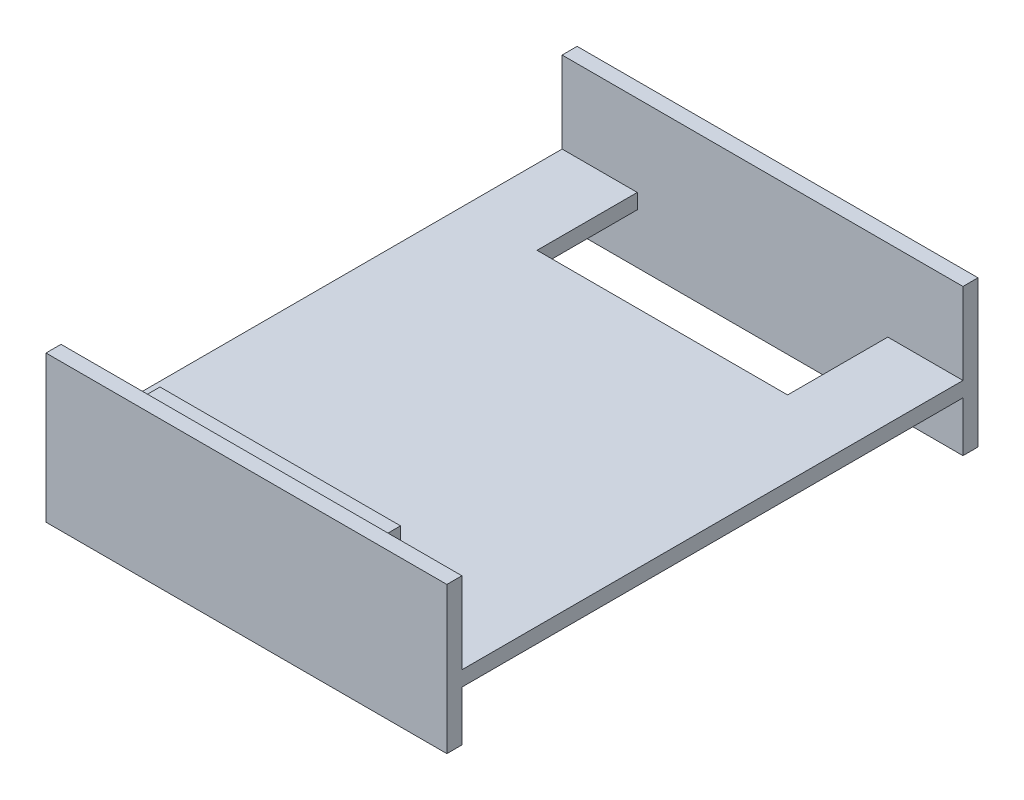
ISO-10303-21;
HEADER;
FILE_DESCRIPTION(('STEP AP214'),'2;1');
FILE_NAME('part.step','',(''),(''),'','','');
FILE_SCHEMA(('AUTOMOTIVE_DESIGN { 1 0 10303 214 1 1 1 1 }'));
ENDSEC;
DATA;
#1=APPLICATION_CONTEXT('core data for automotive mechanical design processes');
#2=APPLICATION_PROTOCOL_DEFINITION('international standard','automotive_design',2000,#1);
#3=PRODUCT_CONTEXT('',#1,'mechanical');
#4=PRODUCT('Part','Part','',(#3));
#5=PRODUCT_RELATED_PRODUCT_CATEGORY('part','',(#4));
#6=PRODUCT_DEFINITION_FORMATION('','',#4);
#7=PRODUCT_DEFINITION_CONTEXT('part definition',#1,'design');
#8=PRODUCT_DEFINITION('design','',#6,#7);
#9=PRODUCT_DEFINITION_SHAPE('','',#8);
#10=(LENGTH_UNIT() NAMED_UNIT(*) SI_UNIT(.MILLI.,.METRE.));
#11=(NAMED_UNIT(*) PLANE_ANGLE_UNIT() SI_UNIT($,.RADIAN.));
#12=(NAMED_UNIT(*) SI_UNIT($,.STERADIAN.) SOLID_ANGLE_UNIT());
#13=UNCERTAINTY_MEASURE_WITH_UNIT(LENGTH_MEASURE(1.E-05),#10,'distance_accuracy_value','');
#14=(GEOMETRIC_REPRESENTATION_CONTEXT(3) GLOBAL_UNCERTAINTY_ASSIGNED_CONTEXT((#13)) GLOBAL_UNIT_ASSIGNED_CONTEXT((#10,
#11,#12)) REPRESENTATION_CONTEXT('',''));
#15=CARTESIAN_POINT('',(0.,0.,0.));
#16=DIRECTION('',(0.,0.,1.));
#17=DIRECTION('',(1.,0.,0.));
#18=AXIS2_PLACEMENT_3D('',#15,#16,#17);
#19=CARTESIAN_POINT('',(0.,0.,0.));
#20=DIRECTION('',(0.,-1.,0.));
#21=DIRECTION('',(0.,0.,-1.));
#22=AXIS2_PLACEMENT_3D('',#19,#20,#21);
#23=PLANE('',#22);
#24=DIRECTION('',(0.,0.,1.));
#25=VECTOR('',#24,1.);
#26=CARTESIAN_POINT('',(0.,0.,-40.));
#27=LINE('',#26,#25);
#28=CARTESIAN_POINT('',(0.,0.,-40.));
#29=VERTEX_POINT('',#28);
#30=CARTESIAN_POINT('',(0.,0.,0.));
#31=VERTEX_POINT('',#30);
#32=EDGE_CURVE('E63',#29,#31,#27,.T.);
#33=ORIENTED_EDGE('',*,*,#32,.F.);
#34=DIRECTION('',(-1.,0.,0.));
#35=VECTOR('',#34,1.);
#36=CARTESIAN_POINT('',(0.,0.,-40.));
#37=LINE('',#36,#35);
#38=CARTESIAN_POINT('',(6.,0.,-40.));
#39=VERTEX_POINT('',#38);
#40=EDGE_CURVE('E425',#39,#29,#37,.T.);
#41=ORIENTED_EDGE('',*,*,#40,.F.);
#42=DIRECTION('',(0.,0.,1.));
#43=VECTOR('',#42,1.);
#44=CARTESIAN_POINT('',(6.,0.,-40.));
#45=LINE('',#44,#43);
#46=CARTESIAN_POINT('',(6.,0.,-32.));
#47=VERTEX_POINT('',#46);
#48=EDGE_CURVE('E260',#39,#47,#45,.T.);
#49=ORIENTED_EDGE('',*,*,#48,.T.);
#50=DIRECTION('',(1.,0.,0.));
#51=VECTOR('',#50,1.);
#52=CARTESIAN_POINT('',(6.,0.,-32.));
#53=LINE('',#52,#51);
#54=CARTESIAN_POINT('',(26.,0.,-32.));
#55=VERTEX_POINT('',#54);
#56=EDGE_CURVE('E237',#47,#55,#53,.T.);
#57=ORIENTED_EDGE('',*,*,#56,.T.);
#58=DIRECTION('',(0.,0.,-1.));
#59=VECTOR('',#58,1.);
#60=CARTESIAN_POINT('',(26.,0.,-32.));
#61=LINE('',#60,#59);
#62=CARTESIAN_POINT('',(26.,0.,-40.));
#63=VERTEX_POINT('',#62);
#64=EDGE_CURVE('E241',#55,#63,#61,.T.);
#65=ORIENTED_EDGE('',*,*,#64,.T.);
#66=CARTESIAN_POINT('',(32.,0.,-40.));
#67=VERTEX_POINT('',#66);
#68=EDGE_CURVE('E56',#67,#63,#37,.T.);
#69=ORIENTED_EDGE('',*,*,#68,.F.);
#70=DIRECTION('',(0.,0.,-1.));
#71=VECTOR('',#70,1.);
#72=CARTESIAN_POINT('',(32.,0.,-41.2));
#73=LINE('',#72,#71);
#74=CARTESIAN_POINT('',(32.,0.,0.));
#75=VERTEX_POINT('',#74);
#76=EDGE_CURVE('E203',#75,#67,#73,.T.);
#77=ORIENTED_EDGE('',*,*,#76,.F.);
#78=DIRECTION('',(1.,0.,0.));
#79=VECTOR('',#78,1.);
#80=CARTESIAN_POINT('',(0.,0.,0.));
#81=LINE('',#80,#79);
#82=EDGE_CURVE('E205',#31,#75,#81,.T.);
#83=ORIENTED_EDGE('',*,*,#82,.F.);
#84=EDGE_LOOP('',(#33,#41,#49,#57,#65,#69,#77,#83));
#85=FACE_BOUND('',#84,.T.);
#86=ADVANCED_FACE('F40',(#85),#23,.T.);
#87=CARTESIAN_POINT('',(0.,1.2,0.));
#88=DIRECTION('',(0.,-1.,0.));
#89=DIRECTION('',(0.,0.,-1.));
#90=AXIS2_PLACEMENT_3D('',#87,#88,#89);
#91=PLANE('',#90);
#92=DIRECTION('',(1.,0.,0.));
#93=VECTOR('',#92,1.);
#94=CARTESIAN_POINT('',(32.,1.2,-40.));
#95=LINE('',#94,#93);
#96=CARTESIAN_POINT('',(26.,1.2,-40.));
#97=VERTEX_POINT('',#96);
#98=CARTESIAN_POINT('',(32.,1.2,-40.));
#99=VERTEX_POINT('',#98);
#100=EDGE_CURVE('E313',#97,#99,#95,.T.);
#101=ORIENTED_EDGE('',*,*,#100,.F.);
#102=DIRECTION('',(0.,0.,-1.));
#103=VECTOR('',#102,1.);
#104=CARTESIAN_POINT('',(26.,1.2,-32.));
#105=LINE('',#104,#103);
#106=CARTESIAN_POINT('',(26.,1.2,-32.));
#107=VERTEX_POINT('',#106);
#108=EDGE_CURVE('E252',#107,#97,#105,.T.);
#109=ORIENTED_EDGE('',*,*,#108,.F.);
#110=DIRECTION('',(1.,0.,0.));
#111=VECTOR('',#110,1.);
#112=CARTESIAN_POINT('',(6.,1.2,-32.));
#113=LINE('',#112,#111);
#114=CARTESIAN_POINT('',(6.,1.2,-32.));
#115=VERTEX_POINT('',#114);
#116=EDGE_CURVE('E248',#115,#107,#113,.T.);
#117=ORIENTED_EDGE('',*,*,#116,.F.);
#118=DIRECTION('',(0.,0.,1.));
#119=VECTOR('',#118,1.);
#120=CARTESIAN_POINT('',(6.,1.2,-40.));
#121=LINE('',#120,#119);
#122=CARTESIAN_POINT('',(6.,1.2,-40.));
#123=VERTEX_POINT('',#122);
#124=EDGE_CURVE('E244',#123,#115,#121,.T.);
#125=ORIENTED_EDGE('',*,*,#124,.F.);
#126=CARTESIAN_POINT('',(0.,1.2,-40.));
#127=VERTEX_POINT('',#126);
#128=EDGE_CURVE('E319',#127,#123,#95,.T.);
#129=ORIENTED_EDGE('',*,*,#128,.F.);
#130=DIRECTION('',(0.,0.,1.));
#131=VECTOR('',#130,1.);
#132=CARTESIAN_POINT('',(0.,1.2,1.2));
#133=LINE('',#132,#131);
#134=CARTESIAN_POINT('',(0.,1.2,0.));
#135=VERTEX_POINT('',#134);
#136=EDGE_CURVE('E367',#127,#135,#133,.T.);
#137=ORIENTED_EDGE('',*,*,#136,.T.);
#138=DIRECTION('',(-1.,0.,0.));
#139=VECTOR('',#138,1.);
#140=CARTESIAN_POINT('',(32.,1.2,0.));
#141=LINE('',#140,#139);
#142=CARTESIAN_POINT('',(6.4,1.2,0.));
#143=VERTEX_POINT('',#142);
#144=EDGE_CURVE('E340',#143,#135,#141,.T.);
#145=ORIENTED_EDGE('',*,*,#144,.F.);
#146=DIRECTION('',(0.,0.,1.));
#147=VECTOR('',#146,1.);
#148=CARTESIAN_POINT('',(6.4,1.2,0.));
#149=LINE('',#148,#147);
#150=CARTESIAN_POINT('',(6.4,1.2,-1.5));
#151=VERTEX_POINT('',#150);
#152=EDGE_CURVE('E278',#151,#143,#149,.T.);
#153=ORIENTED_EDGE('',*,*,#152,.F.);
#154=DIRECTION('',(-1.,0.,0.));
#155=VECTOR('',#154,1.);
#156=CARTESIAN_POINT('',(6.4,1.2,-1.5));
#157=LINE('',#156,#155);
#158=CARTESIAN_POINT('',(25.6,1.2,-1.5));
#159=VERTEX_POINT('',#158);
#160=EDGE_CURVE('E292',#159,#151,#157,.T.);
#161=ORIENTED_EDGE('',*,*,#160,.F.);
#162=DIRECTION('',(0.,0.,-1.));
#163=VECTOR('',#162,1.);
#164=CARTESIAN_POINT('',(25.6,1.2,0.));
#165=LINE('',#164,#163);
#166=CARTESIAN_POINT('',(25.6,1.2,0.));
#167=VERTEX_POINT('',#166);
#168=EDGE_CURVE('E272',#167,#159,#165,.T.);
#169=ORIENTED_EDGE('',*,*,#168,.F.);
#170=CARTESIAN_POINT('',(32.,1.2,0.));
#171=VERTEX_POINT('',#170);
#172=EDGE_CURVE('E346',#171,#167,#141,.T.);
#173=ORIENTED_EDGE('',*,*,#172,.F.);
#174=DIRECTION('',(0.,0.,-1.));
#175=VECTOR('',#174,1.);
#176=CARTESIAN_POINT('',(32.,1.2,1.2));
#177=LINE('',#176,#175);
#178=EDGE_CURVE('E371',#171,#99,#177,.T.);
#179=ORIENTED_EDGE('',*,*,#178,.T.);
#180=EDGE_LOOP('',(#101,#109,#117,#125,#129,#137,#145,#153,#161,#169,#173,#179));
#181=FACE_BOUND('',#180,.T.);
#182=ADVANCED_FACE('F411',(#181),#91,.F.);
#183=CARTESIAN_POINT('',(32.,7.7,0.));
#184=DIRECTION('',(0.,0.,1.));
#185=DIRECTION('',(1.,0.,0.));
#186=AXIS2_PLACEMENT_3D('',#183,#184,#185);
#187=PLANE('',#186);
#188=DIRECTION('',(0.,-1.,0.));
#189=VECTOR('',#188,1.);
#190=CARTESIAN_POINT('',(25.6,7.2,0.));
#191=LINE('',#190,#189);
#192=CARTESIAN_POINT('',(25.6,7.2,0.));
#193=VERTEX_POINT('',#192);
#194=EDGE_CURVE('E309',#193,#167,#191,.T.);
#195=ORIENTED_EDGE('',*,*,#194,.F.);
#196=DIRECTION('',(1.,0.,0.));
#197=VECTOR('',#196,1.);
#198=CARTESIAN_POINT('',(16.,7.2,0.));
#199=LINE('',#198,#197);
#200=CARTESIAN_POINT('',(6.4,7.2,0.));
#201=VERTEX_POINT('',#200);
#202=EDGE_CURVE('E273',#201,#193,#199,.T.);
#203=ORIENTED_EDGE('',*,*,#202,.F.);
#204=DIRECTION('',(0.,-1.,0.));
#205=VECTOR('',#204,1.);
#206=CARTESIAN_POINT('',(6.4,7.2,0.));
#207=LINE('',#206,#205);
#208=EDGE_CURVE('E288',#201,#143,#207,.T.);
#209=ORIENTED_EDGE('',*,*,#208,.T.);
#210=ORIENTED_EDGE('',*,*,#144,.T.);
#211=DIRECTION('',(0.,-1.,0.));
#212=VECTOR('',#211,1.);
#213=CARTESIAN_POINT('',(0.,7.7,0.));
#214=LINE('',#213,#212);
#215=CARTESIAN_POINT('',(0.,7.7,0.));
#216=VERTEX_POINT('',#215);
#217=EDGE_CURVE('E363',#216,#135,#214,.T.);
#218=ORIENTED_EDGE('',*,*,#217,.F.);
#219=DIRECTION('',(-1.,0.,0.));
#220=VECTOR('',#219,1.);
#221=CARTESIAN_POINT('',(32.,7.7,0.));
#222=LINE('',#221,#220);
#223=CARTESIAN_POINT('',(32.,7.7,0.));
#224=VERTEX_POINT('',#223);
#225=EDGE_CURVE('E341',#224,#216,#222,.T.);
#226=ORIENTED_EDGE('',*,*,#225,.F.);
#227=DIRECTION('',(0.,-1.,0.));
#228=VECTOR('',#227,1.);
#229=CARTESIAN_POINT('',(32.,7.7,0.));
#230=LINE('',#229,#228);
#231=EDGE_CURVE('E356',#224,#171,#230,.T.);
#232=ORIENTED_EDGE('',*,*,#231,.T.);
#233=ORIENTED_EDGE('',*,*,#172,.T.);
#234=EDGE_LOOP('',(#195,#203,#209,#210,#218,#226,#232,#233));
#235=FACE_BOUND('',#234,.T.);
#236=ADVANCED_FACE('F403',(#235),#187,.F.);
#237=CARTESIAN_POINT('',(0.,1.2,1.2));
#238=DIRECTION('',(0.,0.,-1.));
#239=DIRECTION('',(-1.,0.,0.));
#240=AXIS2_PLACEMENT_3D('',#237,#238,#239);
#241=PLANE('',#240);
#242=DIRECTION('',(0.,-1.,0.));
#243=VECTOR('',#242,1.);
#244=CARTESIAN_POINT('',(0.,1.2,1.2));
#245=LINE('',#244,#243);
#246=CARTESIAN_POINT('',(0.,7.7,1.2));
#247=VERTEX_POINT('',#246);
#248=CARTESIAN_POINT('',(0.,-4.,1.2));
#249=VERTEX_POINT('',#248);
#250=EDGE_CURVE('E11',#247,#249,#245,.T.);
#251=ORIENTED_EDGE('',*,*,#250,.T.);
#252=DIRECTION('',(-1.,0.,0.));
#253=VECTOR('',#252,1.);
#254=CARTESIAN_POINT('',(32.,-4.,1.2));
#255=LINE('',#254,#253);
#256=CARTESIAN_POINT('',(32.,-4.,1.2));
#257=VERTEX_POINT('',#256);
#258=EDGE_CURVE('E223',#257,#249,#255,.T.);
#259=ORIENTED_EDGE('',*,*,#258,.F.);
#260=DIRECTION('',(0.,-1.,0.));
#261=VECTOR('',#260,1.);
#262=CARTESIAN_POINT('',(32.,1.2,1.2));
#263=LINE('',#262,#261);
#264=CARTESIAN_POINT('',(32.,7.7,1.2));
#265=VERTEX_POINT('',#264);
#266=EDGE_CURVE('E49',#265,#257,#263,.T.);
#267=ORIENTED_EDGE('',*,*,#266,.F.);
#268=DIRECTION('',(1.,0.,0.));
#269=VECTOR('',#268,1.);
#270=CARTESIAN_POINT('',(0.,7.7,1.2));
#271=LINE('',#270,#269);
#272=EDGE_CURVE('E350',#247,#265,#271,.T.);
#273=ORIENTED_EDGE('',*,*,#272,.F.);
#274=EDGE_LOOP('',(#251,#259,#267,#273));
#275=FACE_BOUND('',#274,.T.);
#276=ADVANCED_FACE('F42',(#275),#241,.F.);
#277=CARTESIAN_POINT('',(32.,1.2,-41.2));
#278=DIRECTION('',(-1.,0.,0.));
#279=DIRECTION('',(0.,0.,1.));
#280=AXIS2_PLACEMENT_3D('',#277,#278,#279);
#281=PLANE('',#280);
#282=ORIENTED_EDGE('',*,*,#266,.T.);
#283=DIRECTION('',(0.,0.,1.));
#284=VECTOR('',#283,1.);
#285=CARTESIAN_POINT('',(32.,-4.,0.));
#286=LINE('',#285,#284);
#287=CARTESIAN_POINT('',(32.,-4.,0.));
#288=VERTEX_POINT('',#287);
#289=EDGE_CURVE('E219',#288,#257,#286,.T.);
#290=ORIENTED_EDGE('',*,*,#289,.F.);
#291=DIRECTION('',(0.,1.,0.));
#292=VECTOR('',#291,1.);
#293=CARTESIAN_POINT('',(32.,-4.,0.));
#294=LINE('',#293,#292);
#295=EDGE_CURVE('E234',#288,#75,#294,.T.);
#296=ORIENTED_EDGE('',*,*,#295,.T.);
#297=ORIENTED_EDGE('',*,*,#76,.T.);
#298=DIRECTION('',(0.,1.,0.));
#299=VECTOR('',#298,1.);
#300=CARTESIAN_POINT('',(32.,-4.,-40.));
#301=LINE('',#300,#299);
#302=CARTESIAN_POINT('',(32.,-4.,-40.));
#303=VERTEX_POINT('',#302);
#304=EDGE_CURVE('E183',#303,#67,#301,.T.);
#305=ORIENTED_EDGE('',*,*,#304,.F.);
#306=DIRECTION('',(0.,0.,1.));
#307=VECTOR('',#306,1.);
#308=CARTESIAN_POINT('',(32.,-4.,-41.2));
#309=LINE('',#308,#307);
#310=CARTESIAN_POINT('',(32.,-4.,-41.2));
#311=VERTEX_POINT('',#310);
#312=EDGE_CURVE('E191',#311,#303,#309,.T.);
#313=ORIENTED_EDGE('',*,*,#312,.F.);
#314=DIRECTION('',(0.,-1.,0.));
#315=VECTOR('',#314,1.);
#316=CARTESIAN_POINT('',(32.,1.2,-41.2));
#317=LINE('',#316,#315);
#318=CARTESIAN_POINT('',(32.,7.7,-41.2));
#319=VERTEX_POINT('',#318);
#320=EDGE_CURVE('E382',#319,#311,#317,.T.);
#321=ORIENTED_EDGE('',*,*,#320,.F.);
#322=DIRECTION('',(0.,0.,-1.));
#323=VECTOR('',#322,1.);
#324=CARTESIAN_POINT('',(32.,7.7,-41.2));
#325=LINE('',#324,#323);
#326=CARTESIAN_POINT('',(32.,7.7,-40.));
#327=VERTEX_POINT('',#326);
#328=EDGE_CURVE('E322',#327,#319,#325,.T.);
#329=ORIENTED_EDGE('',*,*,#328,.F.);
#330=DIRECTION('',(0.,-1.,0.));
#331=VECTOR('',#330,1.);
#332=CARTESIAN_POINT('',(32.,7.7,-40.));
#333=LINE('',#332,#331);
#334=EDGE_CURVE('E330',#327,#99,#333,.T.);
#335=ORIENTED_EDGE('',*,*,#334,.T.);
#336=ORIENTED_EDGE('',*,*,#178,.F.);
#337=ORIENTED_EDGE('',*,*,#231,.F.);
#338=DIRECTION('',(0.,0.,-1.));
#339=VECTOR('',#338,1.);
#340=CARTESIAN_POINT('',(32.,7.7,1.2));
#341=LINE('',#340,#339);
#342=EDGE_CURVE('E353',#265,#224,#341,.T.);
#343=ORIENTED_EDGE('',*,*,#342,.F.);
#344=EDGE_LOOP('',(#282,#290,#296,#297,#305,#313,#321,#329,#335,#336,#337,#343));
#345=FACE_BOUND('',#344,.T.);
#346=ADVANCED_FACE('F201',(#345),#281,.F.);
#347=CARTESIAN_POINT('',(0.,1.2,-41.2));
#348=DIRECTION('',(0.,0.,1.));
#349=DIRECTION('',(1.,0.,0.));
#350=AXIS2_PLACEMENT_3D('',#347,#348,#349);
#351=PLANE('',#350);
#352=ORIENTED_EDGE('',*,*,#320,.T.);
#353=DIRECTION('',(1.,0.,0.));
#354=VECTOR('',#353,1.);
#355=CARTESIAN_POINT('',(0.,-4.,-41.2));
#356=LINE('',#355,#354);
#357=CARTESIAN_POINT('',(0.,-4.,-41.2));
#358=VERTEX_POINT('',#357);
#359=EDGE_CURVE('E197',#358,#311,#356,.T.);
#360=ORIENTED_EDGE('',*,*,#359,.F.);
#361=DIRECTION('',(0.,-1.,0.));
#362=VECTOR('',#361,1.);
#363=CARTESIAN_POINT('',(0.,1.2,-41.2));
#364=LINE('',#363,#362);
#365=CARTESIAN_POINT('',(0.,7.7,-41.2));
#366=VERTEX_POINT('',#365);
#367=EDGE_CURVE('E375',#366,#358,#364,.T.);
#368=ORIENTED_EDGE('',*,*,#367,.F.);
#369=DIRECTION('',(-1.,0.,0.));
#370=VECTOR('',#369,1.);
#371=CARTESIAN_POINT('',(0.,7.7,-41.2));
#372=LINE('',#371,#370);
#373=EDGE_CURVE('E326',#319,#366,#372,.T.);
#374=ORIENTED_EDGE('',*,*,#373,.F.);
#375=EDGE_LOOP('',(#352,#360,#368,#374));
#376=FACE_BOUND('',#375,.T.);
#377=ADVANCED_FACE('F421',(#376),#351,.F.);
#378=CARTESIAN_POINT('',(0.,1.2,-40.));
#379=DIRECTION('',(1.,0.,0.));
#380=DIRECTION('',(0.,0.,-1.));
#381=AXIS2_PLACEMENT_3D('',#378,#379,#380);
#382=PLANE('',#381);
#383=ORIENTED_EDGE('',*,*,#367,.T.);
#384=DIRECTION('',(0.,0.,-1.));
#385=VECTOR('',#384,1.);
#386=CARTESIAN_POINT('',(0.,-4.,-40.));
#387=LINE('',#386,#385);
#388=CARTESIAN_POINT('',(0.,-4.,-40.));
#389=VERTEX_POINT('',#388);
#390=EDGE_CURVE('E190',#389,#358,#387,.T.);
#391=ORIENTED_EDGE('',*,*,#390,.F.);
#392=DIRECTION('',(0.,1.,0.));
#393=VECTOR('',#392,1.);
#394=CARTESIAN_POINT('',(0.,-4.,-40.));
#395=LINE('',#394,#393);
#396=EDGE_CURVE('E185',#389,#29,#395,.T.);
#397=ORIENTED_EDGE('',*,*,#396,.T.);
#398=ORIENTED_EDGE('',*,*,#32,.T.);
#399=DIRECTION('',(0.,1.,0.));
#400=VECTOR('',#399,1.);
#401=CARTESIAN_POINT('',(0.,-4.,0.));
#402=LINE('',#401,#400);
#403=CARTESIAN_POINT('',(0.,-4.,0.));
#404=VERTEX_POINT('',#403);
#405=EDGE_CURVE('E229',#404,#31,#402,.T.);
#406=ORIENTED_EDGE('',*,*,#405,.F.);
#407=DIRECTION('',(0.,0.,-1.));
#408=VECTOR('',#407,1.);
#409=CARTESIAN_POINT('',(0.,-4.,1.2));
#410=LINE('',#409,#408);
#411=EDGE_CURVE('E227',#249,#404,#410,.T.);
#412=ORIENTED_EDGE('',*,*,#411,.F.);
#413=ORIENTED_EDGE('',*,*,#250,.F.);
#414=DIRECTION('',(0.,0.,1.));
#415=VECTOR('',#414,1.);
#416=CARTESIAN_POINT('',(0.,7.7,0.));
#417=LINE('',#416,#415);
#418=EDGE_CURVE('E345',#216,#247,#417,.T.);
#419=ORIENTED_EDGE('',*,*,#418,.F.);
#420=ORIENTED_EDGE('',*,*,#217,.T.);
#421=ORIENTED_EDGE('',*,*,#136,.F.);
#422=DIRECTION('',(0.,-1.,0.));
#423=VECTOR('',#422,1.);
#424=CARTESIAN_POINT('',(0.,7.7,-40.));
#425=LINE('',#424,#423);
#426=CARTESIAN_POINT('',(0.,7.7,-40.));
#427=VERTEX_POINT('',#426);
#428=EDGE_CURVE('E336',#427,#127,#425,.T.);
#429=ORIENTED_EDGE('',*,*,#428,.F.);
#430=DIRECTION('',(0.,0.,1.));
#431=VECTOR('',#430,1.);
#432=CARTESIAN_POINT('',(0.,7.7,-40.));
#433=LINE('',#432,#431);
#434=EDGE_CURVE('E314',#366,#427,#433,.T.);
#435=ORIENTED_EDGE('',*,*,#434,.F.);
#436=EDGE_LOOP('',(#383,#391,#397,#398,#406,#412,#413,#419,#420,#421,#429,#435));
#437=FACE_BOUND('',#436,.T.);
#438=ADVANCED_FACE('F396',(#437),#382,.F.);
#439=CARTESIAN_POINT('',(0.,7.7,0.));
#440=DIRECTION('',(0.,1.,0.));
#441=DIRECTION('',(0.,0.,1.));
#442=AXIS2_PLACEMENT_3D('',#439,#440,#441);
#443=PLANE('',#442);
#444=ORIENTED_EDGE('',*,*,#225,.T.);
#445=ORIENTED_EDGE('',*,*,#418,.T.);
#446=ORIENTED_EDGE('',*,*,#272,.T.);
#447=ORIENTED_EDGE('',*,*,#342,.T.);
#448=EDGE_LOOP('',(#444,#445,#446,#447));
#449=FACE_BOUND('',#448,.T.);
#450=ADVANCED_FACE('F399',(#449),#443,.T.);
#451=CARTESIAN_POINT('',(32.,7.7,-40.));
#452=DIRECTION('',(0.,0.,-1.));
#453=DIRECTION('',(-1.,0.,0.));
#454=AXIS2_PLACEMENT_3D('',#451,#452,#453);
#455=PLANE('',#454);
#456=ORIENTED_EDGE('',*,*,#128,.T.);
#457=DIRECTION('',(0.,1.,0.));
#458=VECTOR('',#457,1.);
#459=CARTESIAN_POINT('',(6.,-0.000999999999999916,-40.));
#460=LINE('',#459,#458);
#461=EDGE_CURVE('E255',#39,#123,#460,.T.);
#462=ORIENTED_EDGE('',*,*,#461,.F.);
#463=ORIENTED_EDGE('',*,*,#40,.T.);
#464=ORIENTED_EDGE('',*,*,#396,.F.);
#465=DIRECTION('',(-1.,0.,0.));
#466=VECTOR('',#465,1.);
#467=CARTESIAN_POINT('',(0.,-4.,-40.));
#468=LINE('',#467,#466);
#469=EDGE_CURVE('E178',#303,#389,#468,.T.);
#470=ORIENTED_EDGE('',*,*,#469,.F.);
#471=ORIENTED_EDGE('',*,*,#304,.T.);
#472=ORIENTED_EDGE('',*,*,#68,.T.);
#473=DIRECTION('',(0.,1.,0.));
#474=VECTOR('',#473,1.);
#475=CARTESIAN_POINT('',(26.,-0.000999999999999916,-40.));
#476=LINE('',#475,#474);
#477=EDGE_CURVE('E256',#63,#97,#476,.T.);
#478=ORIENTED_EDGE('',*,*,#477,.T.);
#479=ORIENTED_EDGE('',*,*,#100,.T.);
#480=ORIENTED_EDGE('',*,*,#334,.F.);
#481=DIRECTION('',(1.,0.,0.));
#482=VECTOR('',#481,1.);
#483=CARTESIAN_POINT('',(32.,7.7,-40.));
#484=LINE('',#483,#482);
#485=EDGE_CURVE('E318',#427,#327,#484,.T.);
#486=ORIENTED_EDGE('',*,*,#485,.F.);
#487=ORIENTED_EDGE('',*,*,#428,.T.);
#488=EDGE_LOOP('',(#456,#462,#463,#464,#470,#471,#472,#478,#479,#480,#486,#487));
#489=FACE_BOUND('',#488,.T.);
#490=ADVANCED_FACE('F181',(#489),#455,.F.);
#491=CARTESIAN_POINT('',(0.,7.7,0.));
#492=DIRECTION('',(0.,-1.,0.));
#493=DIRECTION('',(0.,0.,-1.));
#494=AXIS2_PLACEMENT_3D('',#491,#492,#493);
#495=PLANE('',#494);
#496=ORIENTED_EDGE('',*,*,#434,.T.);
#497=ORIENTED_EDGE('',*,*,#485,.T.);
#498=ORIENTED_EDGE('',*,*,#328,.T.);
#499=ORIENTED_EDGE('',*,*,#373,.T.);
#500=EDGE_LOOP('',(#496,#497,#498,#499));
#501=FACE_BOUND('',#500,.T.);
#502=ADVANCED_FACE('F416',(#501),#495,.F.);
#503=CARTESIAN_POINT('',(25.6,7.2,0.));
#504=DIRECTION('',(-1.,0.,0.));
#505=DIRECTION('',(0.,0.,1.));
#506=AXIS2_PLACEMENT_3D('',#503,#504,#505);
#507=PLANE('',#506);
#508=ORIENTED_EDGE('',*,*,#168,.T.);
#509=DIRECTION('',(0.,-1.,0.));
#510=VECTOR('',#509,1.);
#511=CARTESIAN_POINT('',(25.6,7.2,-1.5));
#512=LINE('',#511,#510);
#513=CARTESIAN_POINT('',(25.6,7.2,-1.5));
#514=VERTEX_POINT('',#513);
#515=EDGE_CURVE('E305',#514,#159,#512,.T.);
#516=ORIENTED_EDGE('',*,*,#515,.F.);
#517=DIRECTION('',(0.,0.,-1.));
#518=VECTOR('',#517,1.);
#519=CARTESIAN_POINT('',(25.6,7.2,0.));
#520=LINE('',#519,#518);
#521=EDGE_CURVE('E277',#193,#514,#520,.T.);
#522=ORIENTED_EDGE('',*,*,#521,.F.);
#523=ORIENTED_EDGE('',*,*,#194,.T.);
#524=EDGE_LOOP('',(#508,#516,#522,#523));
#525=FACE_BOUND('',#524,.T.);
#526=ADVANCED_FACE('F469',(#525),#507,.F.);
#527=CARTESIAN_POINT('',(6.4,7.2,-1.5));
#528=DIRECTION('',(0.,0.,1.));
#529=DIRECTION('',(1.,0.,0.));
#530=AXIS2_PLACEMENT_3D('',#527,#528,#529);
#531=PLANE('',#530);
#532=ORIENTED_EDGE('',*,*,#160,.T.);
#533=DIRECTION('',(0.,-1.,0.));
#534=VECTOR('',#533,1.);
#535=CARTESIAN_POINT('',(6.4,7.2,-1.5));
#536=LINE('',#535,#534);
#537=CARTESIAN_POINT('',(6.4,7.2,-1.5));
#538=VERTEX_POINT('',#537);
#539=EDGE_CURVE('E301',#538,#151,#536,.T.);
#540=ORIENTED_EDGE('',*,*,#539,.F.);
#541=DIRECTION('',(-1.,0.,0.));
#542=VECTOR('',#541,1.);
#543=CARTESIAN_POINT('',(6.4,7.2,-1.5));
#544=LINE('',#543,#542);
#545=EDGE_CURVE('E281',#514,#538,#544,.T.);
#546=ORIENTED_EDGE('',*,*,#545,.F.);
#547=ORIENTED_EDGE('',*,*,#515,.T.);
#548=EDGE_LOOP('',(#532,#540,#546,#547));
#549=FACE_BOUND('',#548,.T.);
#550=ADVANCED_FACE('F472',(#549),#531,.F.);
#551=CARTESIAN_POINT('',(6.4,7.2,0.));
#552=DIRECTION('',(1.,0.,0.));
#553=DIRECTION('',(0.,0.,-1.));
#554=AXIS2_PLACEMENT_3D('',#551,#552,#553);
#555=PLANE('',#554);
#556=ORIENTED_EDGE('',*,*,#152,.T.);
#557=ORIENTED_EDGE('',*,*,#208,.F.);
#558=DIRECTION('',(0.,0.,1.));
#559=VECTOR('',#558,1.);
#560=CARTESIAN_POINT('',(6.4,7.2,0.));
#561=LINE('',#560,#559);
#562=EDGE_CURVE('E284',#538,#201,#561,.T.);
#563=ORIENTED_EDGE('',*,*,#562,.F.);
#564=ORIENTED_EDGE('',*,*,#539,.T.);
#565=EDGE_LOOP('',(#556,#557,#563,#564));
#566=FACE_BOUND('',#565,.T.);
#567=ADVANCED_FACE('F476',(#566),#555,.F.);
#568=CARTESIAN_POINT('',(0.,7.2,0.));
#569=DIRECTION('',(0.,-1.,0.));
#570=DIRECTION('',(0.,0.,-1.));
#571=AXIS2_PLACEMENT_3D('',#568,#569,#570);
#572=PLANE('',#571);
#573=ORIENTED_EDGE('',*,*,#202,.T.);
#574=ORIENTED_EDGE('',*,*,#521,.T.);
#575=ORIENTED_EDGE('',*,*,#545,.T.);
#576=ORIENTED_EDGE('',*,*,#562,.T.);
#577=EDGE_LOOP('',(#573,#574,#575,#576));
#578=FACE_BOUND('',#577,.T.);
#579=ADVANCED_FACE('F480',(#578),#572,.F.);
#580=CARTESIAN_POINT('',(26.,-0.000999999999999916,-32.));
#581=DIRECTION('',(1.,0.,0.));
#582=DIRECTION('',(0.,0.,-1.));
#583=AXIS2_PLACEMENT_3D('',#580,#581,#582);
#584=PLANE('',#583);
#585=DIRECTION('',(0.,1.,0.));
#586=VECTOR('',#585,1.);
#587=CARTESIAN_POINT('',(26.,-0.000999999999999916,-32.));
#588=LINE('',#587,#586);
#589=EDGE_CURVE('E261',#55,#107,#588,.T.);
#590=ORIENTED_EDGE('',*,*,#589,.T.);
#591=ORIENTED_EDGE('',*,*,#108,.T.);
#592=ORIENTED_EDGE('',*,*,#477,.F.);
#593=ORIENTED_EDGE('',*,*,#64,.F.);
#594=EDGE_LOOP('',(#590,#591,#592,#593));
#595=FACE_BOUND('',#594,.T.);
#596=ADVANCED_FACE('F483',(#595),#584,.F.);
#597=CARTESIAN_POINT('',(6.,-0.000999999999999916,-32.));
#598=DIRECTION('',(0.,0.,1.));
#599=DIRECTION('',(1.,0.,0.));
#600=AXIS2_PLACEMENT_3D('',#597,#598,#599);
#601=PLANE('',#600);
#602=DIRECTION('',(0.,1.,0.));
#603=VECTOR('',#602,1.);
#604=CARTESIAN_POINT('',(6.,-0.000999999999999916,-32.));
#605=LINE('',#604,#603);
#606=EDGE_CURVE('E264',#47,#115,#605,.T.);
#607=ORIENTED_EDGE('',*,*,#606,.T.);
#608=ORIENTED_EDGE('',*,*,#116,.T.);
#609=ORIENTED_EDGE('',*,*,#589,.F.);
#610=ORIENTED_EDGE('',*,*,#56,.F.);
#611=EDGE_LOOP('',(#607,#608,#609,#610));
#612=FACE_BOUND('',#611,.T.);
#613=ADVANCED_FACE('F438',(#612),#601,.F.);
#614=CARTESIAN_POINT('',(6.,-0.000999999999999916,-40.));
#615=DIRECTION('',(-1.,0.,0.));
#616=DIRECTION('',(0.,0.,1.));
#617=AXIS2_PLACEMENT_3D('',#614,#615,#616);
#618=PLANE('',#617);
#619=ORIENTED_EDGE('',*,*,#461,.T.);
#620=ORIENTED_EDGE('',*,*,#124,.T.);
#621=ORIENTED_EDGE('',*,*,#606,.F.);
#622=ORIENTED_EDGE('',*,*,#48,.F.);
#623=EDGE_LOOP('',(#619,#620,#621,#622));
#624=FACE_BOUND('',#623,.T.);
#625=ADVANCED_FACE('F431',(#624),#618,.F.);
#626=CARTESIAN_POINT('',(0.,-4.,0.));
#627=DIRECTION('',(0.,0.,1.));
#628=DIRECTION('',(1.,0.,0.));
#629=AXIS2_PLACEMENT_3D('',#626,#627,#628);
#630=PLANE('',#629);
#631=ORIENTED_EDGE('',*,*,#82,.T.);
#632=ORIENTED_EDGE('',*,*,#295,.F.);
#633=DIRECTION('',(1.,0.,0.));
#634=VECTOR('',#633,1.);
#635=CARTESIAN_POINT('',(0.,-4.,0.));
#636=LINE('',#635,#634);
#637=EDGE_CURVE('E210',#404,#288,#636,.T.);
#638=ORIENTED_EDGE('',*,*,#637,.F.);
#639=ORIENTED_EDGE('',*,*,#405,.T.);
#640=EDGE_LOOP('',(#631,#632,#638,#639));
#641=FACE_BOUND('',#640,.T.);
#642=ADVANCED_FACE('F429',(#641),#630,.F.);
#643=CARTESIAN_POINT('',(0.,-4.,0.));
#644=DIRECTION('',(0.,-1.,0.));
#645=DIRECTION('',(0.,0.,-1.));
#646=AXIS2_PLACEMENT_3D('',#643,#644,#645);
#647=PLANE('',#646);
#648=ORIENTED_EDGE('',*,*,#637,.T.);
#649=ORIENTED_EDGE('',*,*,#289,.T.);
#650=ORIENTED_EDGE('',*,*,#258,.T.);
#651=ORIENTED_EDGE('',*,*,#411,.T.);
#652=EDGE_LOOP('',(#648,#649,#650,#651));
#653=FACE_BOUND('',#652,.T.);
#654=ADVANCED_FACE('F391',(#653),#647,.T.);
#655=CARTESIAN_POINT('',(0.,-4.,0.));
#656=DIRECTION('',(0.,1.,0.));
#657=DIRECTION('',(0.,0.,1.));
#658=AXIS2_PLACEMENT_3D('',#655,#656,#657);
#659=PLANE('',#658);
#660=ORIENTED_EDGE('',*,*,#312,.T.);
#661=ORIENTED_EDGE('',*,*,#469,.T.);
#662=ORIENTED_EDGE('',*,*,#390,.T.);
#663=ORIENTED_EDGE('',*,*,#359,.T.);
#664=EDGE_LOOP('',(#660,#661,#662,#663));
#665=FACE_BOUND('',#664,.T.);
#666=ADVANCED_FACE('F195',(#665),#659,.F.);
#667=CLOSED_SHELL('',(#86,#182,#236,#276,#346,#377,#438,#450,#490,#502,#526,#550,#567,#579,#596,
#613,#625,#642,#654,#666));
#668=MANIFOLD_SOLID_BREP('B2',#667);
#669=ADVANCED_BREP_SHAPE_REPRESENTATION('',(#18,#668),#14);
#670=SHAPE_DEFINITION_REPRESENTATION(#9,#669);
ENDSEC;
END-ISO-10303-21;
